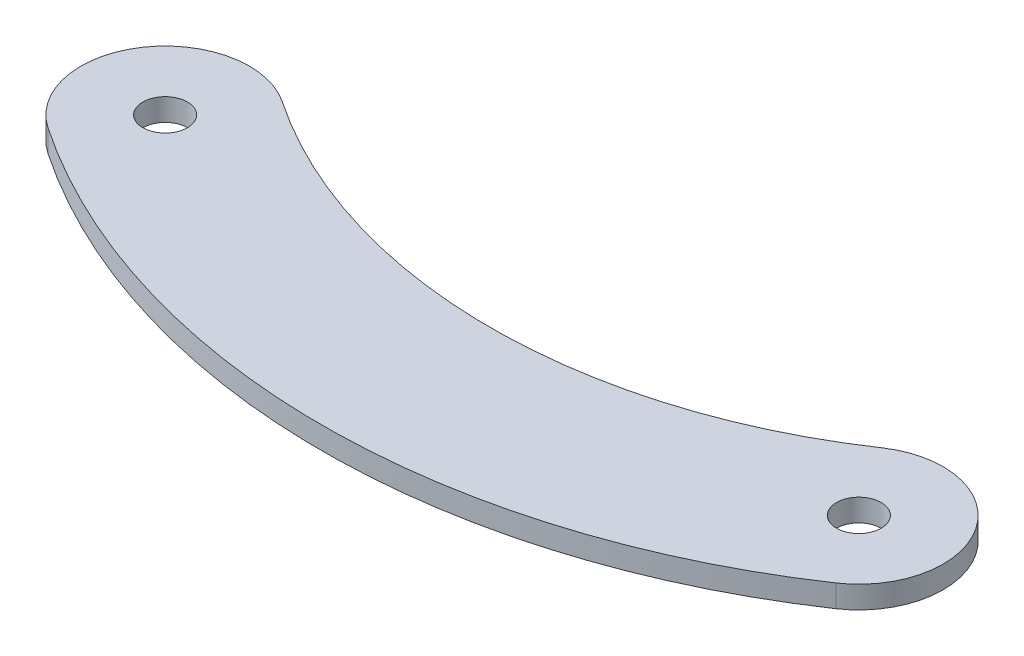
ISO-10303-21;
HEADER;
FILE_DESCRIPTION(('STEP AP214'),'2;1');
FILE_NAME('part.step','',(''),(''),'','','');
FILE_SCHEMA(('AUTOMOTIVE_DESIGN { 1 0 10303 214 1 1 1 1 }'));
ENDSEC;
DATA;
#1=APPLICATION_CONTEXT('core data for automotive mechanical design processes');
#2=APPLICATION_PROTOCOL_DEFINITION('international standard','automotive_design',2000,#1);
#3=PRODUCT_CONTEXT('',#1,'mechanical');
#4=PRODUCT('Part','Part','',(#3));
#5=PRODUCT_RELATED_PRODUCT_CATEGORY('part','',(#4));
#6=PRODUCT_DEFINITION_FORMATION('','',#4);
#7=PRODUCT_DEFINITION_CONTEXT('part definition',#1,'design');
#8=PRODUCT_DEFINITION('design','',#6,#7);
#9=PRODUCT_DEFINITION_SHAPE('','',#8);
#10=(LENGTH_UNIT() NAMED_UNIT(*) SI_UNIT(.MILLI.,.METRE.));
#11=(NAMED_UNIT(*) PLANE_ANGLE_UNIT() SI_UNIT($,.RADIAN.));
#12=(NAMED_UNIT(*) SI_UNIT($,.STERADIAN.) SOLID_ANGLE_UNIT());
#13=UNCERTAINTY_MEASURE_WITH_UNIT(LENGTH_MEASURE(1.E-05),#10,'distance_accuracy_value','');
#14=(GEOMETRIC_REPRESENTATION_CONTEXT(3) GLOBAL_UNCERTAINTY_ASSIGNED_CONTEXT((#13)) GLOBAL_UNIT_ASSIGNED_CONTEXT((#10,
#11,#12)) REPRESENTATION_CONTEXT('',''));
#15=CARTESIAN_POINT('',(0.,0.,0.));
#16=DIRECTION('',(0.,0.,1.));
#17=DIRECTION('',(1.,0.,0.));
#18=AXIS2_PLACEMENT_3D('',#15,#16,#17);
#19=CARTESIAN_POINT('',(-12.336,0.79375,-18.3071001095243));
#20=DIRECTION('',(0.,1.,0.));
#21=DIRECTION('',(0.,0.,1.));
#22=AXIS2_PLACEMENT_3D('',#19,#20,#21);
#23=PLANE('',#22);
#24=CARTESIAN_POINT('',(-24.672,0.79375,0.));
#25=DIRECTION('',(0.,1.,0.));
#26=DIRECTION('',(0.,0.,1.));
#27=AXIS2_PLACEMENT_3D('',#24,#25,#26);
#28=CIRCLE('',#27,1.5875);
#29=CARTESIAN_POINT('',(-24.672,0.79375,1.5875));
#30=VERTEX_POINT('',#29);
#31=EDGE_CURVE('E100',#30,#30,#28,.T.);
#32=ORIENTED_EDGE('',*,*,#31,.F.);
#33=EDGE_LOOP('',(#32));
#34=FACE_BOUND('',#33,.T.);
#35=CARTESIAN_POINT('',(-24.672,0.79375,0.));
#36=DIRECTION('',(0.,1.,0.));
#37=DIRECTION('',(0.,0.,1.));
#38=AXIS2_PLACEMENT_3D('',#35,#36,#37);
#39=CIRCLE('',#38,6.);
#40=CARTESIAN_POINT('',(-21.3191396990156,0.79375,-4.97577409074031));
#41=VERTEX_POINT('',#40);
#42=CARTESIAN_POINT('',(-28.0248603009845,0.79375,4.97577409074027));
#43=VERTEX_POINT('',#42);
#44=EDGE_CURVE('E85',#41,#43,#39,.T.);
#45=ORIENTED_EDGE('',*,*,#44,.T.);
#46=CARTESIAN_POINT('',(0.,0.79375,-36.6142002190486));
#47=DIRECTION('',(0.,1.,0.));
#48=DIRECTION('',(0.,0.,1.));
#49=AXIS2_PLACEMENT_3D('',#46,#47,#48);
#50=CIRCLE('',#49,50.1509596915014);
#51=CARTESIAN_POINT('',(28.0248603009845,0.79375,4.97577409074029));
#52=VERTEX_POINT('',#51);
#53=EDGE_CURVE('E80',#43,#52,#50,.T.);
#54=ORIENTED_EDGE('',*,*,#53,.T.);
#55=CARTESIAN_POINT('',(24.672,0.79375,0.));
#56=DIRECTION('',(0.,1.,0.));
#57=DIRECTION('',(0.,0.,1.));
#58=AXIS2_PLACEMENT_3D('',#55,#56,#57);
#59=CIRCLE('',#58,5.99999999999999);
#60=CARTESIAN_POINT('',(21.3191396990155,0.79375,-4.97577409074028));
#61=VERTEX_POINT('',#60);
#62=EDGE_CURVE('E83',#52,#61,#59,.T.);
#63=ORIENTED_EDGE('',*,*,#62,.T.);
#64=CARTESIAN_POINT('',(0.,0.79375,-36.6142002190486));
#65=DIRECTION('',(0.,-1.,0.));
#66=DIRECTION('',(0.,0.,1.));
#67=AXIS2_PLACEMENT_3D('',#64,#65,#66);
#68=CIRCLE('',#67,38.1509596915014);
#69=EDGE_CURVE('E50',#61,#41,#68,.T.);
#70=ORIENTED_EDGE('',*,*,#69,.T.);
#71=EDGE_LOOP('',(#45,#54,#63,#70));
#72=FACE_BOUND('',#71,.T.);
#73=CARTESIAN_POINT('',(24.672,0.79375,0.));
#74=DIRECTION('',(0.,1.,0.));
#75=DIRECTION('',(0.,0.,1.));
#76=AXIS2_PLACEMENT_3D('',#73,#74,#75);
#77=CIRCLE('',#76,1.5875);
#78=CARTESIAN_POINT('',(24.672,0.79375,1.5875));
#79=VERTEX_POINT('',#78);
#80=EDGE_CURVE('E115',#79,#79,#77,.T.);
#81=ORIENTED_EDGE('',*,*,#80,.F.);
#82=EDGE_LOOP('',(#81));
#83=FACE_BOUND('',#82,.T.);
#84=ADVANCED_FACE('F33',(#34,#72,#83),#23,.T.);
#85=CARTESIAN_POINT('',(-12.336,-0.79375,-18.3071001095243));
#86=DIRECTION('',(0.,1.,0.));
#87=DIRECTION('',(0.,0.,1.));
#88=AXIS2_PLACEMENT_3D('',#85,#86,#87);
#89=PLANE('',#88);
#90=CARTESIAN_POINT('',(-24.672,-0.79375,0.));
#91=DIRECTION('',(0.,1.,0.));
#92=DIRECTION('',(0.,0.,1.));
#93=AXIS2_PLACEMENT_3D('',#90,#91,#92);
#94=CIRCLE('',#93,1.5875);
#95=CARTESIAN_POINT('',(-24.672,-0.79375,1.5875));
#96=VERTEX_POINT('',#95);
#97=EDGE_CURVE('E112',#96,#96,#94,.T.);
#98=ORIENTED_EDGE('',*,*,#97,.T.);
#99=EDGE_LOOP('',(#98));
#100=FACE_BOUND('',#99,.T.);
#101=CARTESIAN_POINT('',(-24.672,-0.79375,0.));
#102=DIRECTION('',(0.,1.,0.));
#103=DIRECTION('',(0.,0.,1.));
#104=AXIS2_PLACEMENT_3D('',#101,#102,#103);
#105=CIRCLE('',#104,6.);
#106=CARTESIAN_POINT('',(-21.3191396990156,-0.79375,-4.97577409074031));
#107=VERTEX_POINT('',#106);
#108=CARTESIAN_POINT('',(-28.0248603009845,-0.79375,4.97577409074027));
#109=VERTEX_POINT('',#108);
#110=EDGE_CURVE('E97',#107,#109,#105,.T.);
#111=ORIENTED_EDGE('',*,*,#110,.F.);
#112=CARTESIAN_POINT('',(0.,-0.79375,-36.6142002190486));
#113=DIRECTION('',(0.,-1.,0.));
#114=DIRECTION('',(0.,0.,1.));
#115=AXIS2_PLACEMENT_3D('',#112,#113,#114);
#116=CIRCLE('',#115,38.1509596915014);
#117=CARTESIAN_POINT('',(21.3191396990155,-0.79375,-4.97577409074028));
#118=VERTEX_POINT('',#117);
#119=EDGE_CURVE('E73',#118,#107,#116,.T.);
#120=ORIENTED_EDGE('',*,*,#119,.F.);
#121=CARTESIAN_POINT('',(24.672,-0.79375,0.));
#122=DIRECTION('',(0.,1.,0.));
#123=DIRECTION('',(0.,0.,1.));
#124=AXIS2_PLACEMENT_3D('',#121,#122,#123);
#125=CIRCLE('',#124,5.99999999999999);
#126=CARTESIAN_POINT('',(28.0248603009845,-0.79375,4.97577409074029));
#127=VERTEX_POINT('',#126);
#128=EDGE_CURVE('E67',#127,#118,#125,.T.);
#129=ORIENTED_EDGE('',*,*,#128,.F.);
#130=CARTESIAN_POINT('',(0.,-0.79375,-36.6142002190486));
#131=DIRECTION('',(0.,1.,0.));
#132=DIRECTION('',(0.,0.,1.));
#133=AXIS2_PLACEMENT_3D('',#130,#131,#132);
#134=CIRCLE('',#133,50.1509596915014);
#135=EDGE_CURVE('E89',#109,#127,#134,.T.);
#136=ORIENTED_EDGE('',*,*,#135,.F.);
#137=EDGE_LOOP('',(#111,#120,#129,#136));
#138=FACE_BOUND('',#137,.T.);
#139=CARTESIAN_POINT('',(24.672,-0.79375,0.));
#140=DIRECTION('',(0.,1.,0.));
#141=DIRECTION('',(0.,0.,1.));
#142=AXIS2_PLACEMENT_3D('',#139,#140,#141);
#143=CIRCLE('',#142,1.5875);
#144=CARTESIAN_POINT('',(24.672,-0.79375,1.5875));
#145=VERTEX_POINT('',#144);
#146=EDGE_CURVE('E118',#145,#145,#143,.T.);
#147=ORIENTED_EDGE('',*,*,#146,.T.);
#148=EDGE_LOOP('',(#147));
#149=FACE_BOUND('',#148,.T.);
#150=ADVANCED_FACE('F108',(#100,#138,#149),#89,.F.);
#151=CARTESIAN_POINT('',(-24.672,0.79375,0.));
#152=DIRECTION('',(0.,-1.,0.));
#153=DIRECTION('',(0.,0.,-1.));
#154=AXIS2_PLACEMENT_3D('',#151,#152,#153);
#155=CYLINDRICAL_SURFACE('',#154,6.);
#156=ORIENTED_EDGE('',*,*,#110,.T.);
#157=DIRECTION('',(0.,-1.,0.));
#158=VECTOR('',#157,1.);
#159=CARTESIAN_POINT('',(-28.0248603009845,0.79375,4.97577409074027));
#160=LINE('',#159,#158);
#161=EDGE_CURVE('E11',#43,#109,#160,.T.);
#162=ORIENTED_EDGE('',*,*,#161,.F.);
#163=ORIENTED_EDGE('',*,*,#44,.F.);
#164=DIRECTION('',(0.,-1.,0.));
#165=VECTOR('',#164,1.);
#166=CARTESIAN_POINT('',(-21.3191396990156,0.79375,-4.97577409074031));
#167=LINE('',#166,#165);
#168=EDGE_CURVE('E93',#41,#107,#167,.T.);
#169=ORIENTED_EDGE('',*,*,#168,.T.);
#170=EDGE_LOOP('',(#156,#162,#163,#169));
#171=FACE_BOUND('',#170,.T.);
#172=ADVANCED_FACE('F35',(#171),#155,.T.);
#173=CARTESIAN_POINT('',(0.,0.79375,-36.6142002190486));
#174=DIRECTION('',(0.,-1.,0.));
#175=DIRECTION('',(0.,0.,-1.));
#176=AXIS2_PLACEMENT_3D('',#173,#174,#175);
#177=CYLINDRICAL_SURFACE('',#176,50.1509596915014);
#178=ORIENTED_EDGE('',*,*,#135,.T.);
#179=DIRECTION('',(0.,-1.,0.));
#180=VECTOR('',#179,1.);
#181=CARTESIAN_POINT('',(28.0248603009845,0.79375,4.97577409074029));
#182=LINE('',#181,#180);
#183=EDGE_CURVE('E42',#52,#127,#182,.T.);
#184=ORIENTED_EDGE('',*,*,#183,.F.);
#185=ORIENTED_EDGE('',*,*,#53,.F.);
#186=ORIENTED_EDGE('',*,*,#161,.T.);
#187=EDGE_LOOP('',(#178,#184,#185,#186));
#188=FACE_BOUND('',#187,.T.);
#189=ADVANCED_FACE('F88',(#188),#177,.T.);
#190=CARTESIAN_POINT('',(24.672,0.79375,0.));
#191=DIRECTION('',(0.,-1.,0.));
#192=DIRECTION('',(0.,0.,-1.));
#193=AXIS2_PLACEMENT_3D('',#190,#191,#192);
#194=CYLINDRICAL_SURFACE('',#193,5.99999999999999);
#195=ORIENTED_EDGE('',*,*,#128,.T.);
#196=DIRECTION('',(0.,-1.,0.));
#197=VECTOR('',#196,1.);
#198=CARTESIAN_POINT('',(21.3191396990155,0.79375,-4.97577409074028));
#199=LINE('',#198,#197);
#200=EDGE_CURVE('E90',#61,#118,#199,.T.);
#201=ORIENTED_EDGE('',*,*,#200,.F.);
#202=ORIENTED_EDGE('',*,*,#62,.F.);
#203=ORIENTED_EDGE('',*,*,#183,.T.);
#204=EDGE_LOOP('',(#195,#201,#202,#203));
#205=FACE_BOUND('',#204,.T.);
#206=ADVANCED_FACE('F91',(#205),#194,.T.);
#207=CARTESIAN_POINT('',(0.,0.79375,-36.6142002190486));
#208=DIRECTION('',(0.,-1.,0.));
#209=DIRECTION('',(0.,0.,-1.));
#210=AXIS2_PLACEMENT_3D('',#207,#208,#209);
#211=CYLINDRICAL_SURFACE('',#210,38.1509596915014);
#212=ORIENTED_EDGE('',*,*,#119,.T.);
#213=ORIENTED_EDGE('',*,*,#168,.F.);
#214=ORIENTED_EDGE('',*,*,#69,.F.);
#215=ORIENTED_EDGE('',*,*,#200,.T.);
#216=EDGE_LOOP('',(#212,#213,#214,#215));
#217=FACE_BOUND('',#216,.T.);
#218=ADVANCED_FACE('F105',(#217),#211,.F.);
#219=CARTESIAN_POINT('',(-24.672,0.79375,0.));
#220=DIRECTION('',(0.,-1.,0.));
#221=DIRECTION('',(0.,0.,-1.));
#222=AXIS2_PLACEMENT_3D('',#219,#220,#221);
#223=CYLINDRICAL_SURFACE('',#222,1.5875);
#224=ORIENTED_EDGE('',*,*,#31,.T.);
#225=EDGE_LOOP('',(#224));
#226=FACE_BOUND('',#225,.T.);
#227=ORIENTED_EDGE('',*,*,#97,.F.);
#228=EDGE_LOOP('',(#227));
#229=FACE_BOUND('',#228,.T.);
#230=ADVANCED_FACE('F136',(#226,#229),#223,.F.);
#231=CARTESIAN_POINT('',(24.672,0.79375,0.));
#232=DIRECTION('',(0.,-1.,0.));
#233=DIRECTION('',(0.,0.,-1.));
#234=AXIS2_PLACEMENT_3D('',#231,#232,#233);
#235=CYLINDRICAL_SURFACE('',#234,1.5875);
#236=ORIENTED_EDGE('',*,*,#80,.T.);
#237=EDGE_LOOP('',(#236));
#238=FACE_BOUND('',#237,.T.);
#239=ORIENTED_EDGE('',*,*,#146,.F.);
#240=EDGE_LOOP('',(#239));
#241=FACE_BOUND('',#240,.T.);
#242=ADVANCED_FACE('F124',(#238,#241),#235,.F.);
#243=CLOSED_SHELL('',(#84,#150,#172,#189,#206,#218,#230,#242));
#244=MANIFOLD_SOLID_BREP('B2',#243);
#245=ADVANCED_BREP_SHAPE_REPRESENTATION('',(#18,#244),#14);
#246=SHAPE_DEFINITION_REPRESENTATION(#9,#245);
ENDSEC;
END-ISO-10303-21;
